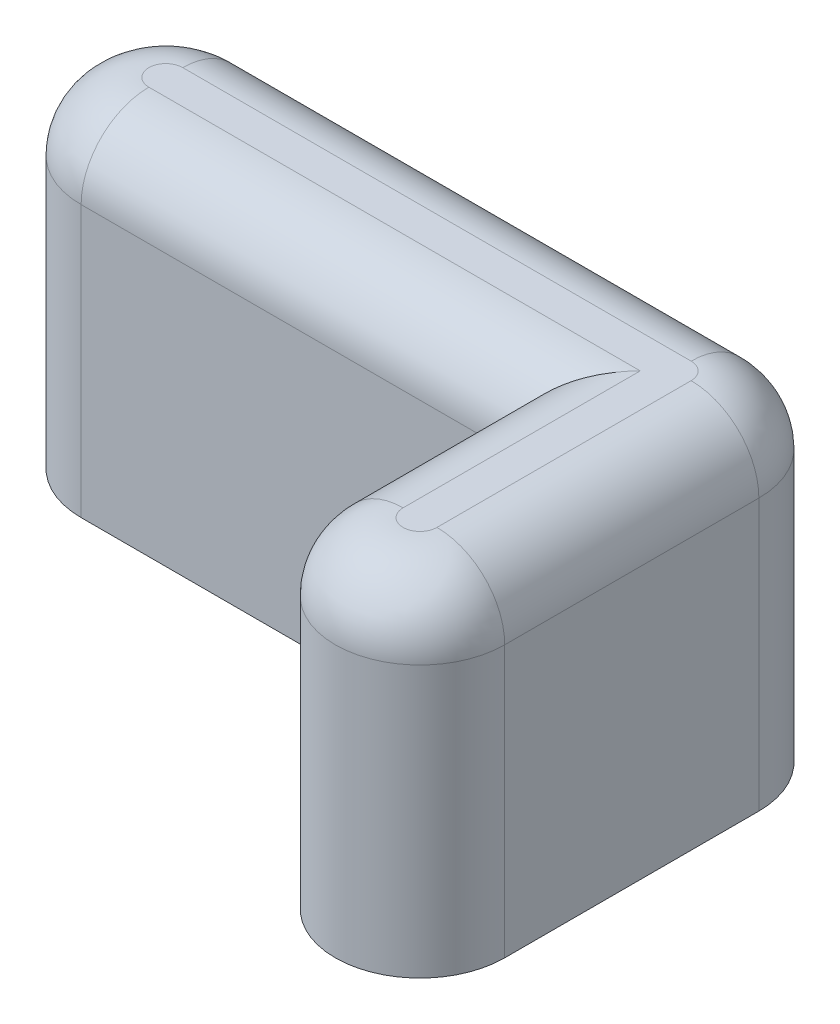
ISO-10303-21;
HEADER;
FILE_DESCRIPTION(('STEP AP214'),'2;1');
FILE_NAME('part.step','',(''),(''),'','','');
FILE_SCHEMA(('AUTOMOTIVE_DESIGN { 1 0 10303 214 1 1 1 1 }'));
ENDSEC;
DATA;
#1=APPLICATION_CONTEXT('core data for automotive mechanical design processes');
#2=APPLICATION_PROTOCOL_DEFINITION('international standard','automotive_design',2000,#1);
#3=PRODUCT_CONTEXT('',#1,'mechanical');
#4=PRODUCT('Part','Part','',(#3));
#5=PRODUCT_RELATED_PRODUCT_CATEGORY('part','',(#4));
#6=PRODUCT_DEFINITION_FORMATION('','',#4);
#7=PRODUCT_DEFINITION_CONTEXT('part definition',#1,'design');
#8=PRODUCT_DEFINITION('design','',#6,#7);
#9=PRODUCT_DEFINITION_SHAPE('','',#8);
#10=(LENGTH_UNIT() NAMED_UNIT(*) SI_UNIT(.MILLI.,.METRE.));
#11=(NAMED_UNIT(*) PLANE_ANGLE_UNIT() SI_UNIT($,.RADIAN.));
#12=(NAMED_UNIT(*) SI_UNIT($,.STERADIAN.) SOLID_ANGLE_UNIT());
#13=UNCERTAINTY_MEASURE_WITH_UNIT(LENGTH_MEASURE(1.E-05),#10,'distance_accuracy_value','');
#14=(GEOMETRIC_REPRESENTATION_CONTEXT(3) GLOBAL_UNCERTAINTY_ASSIGNED_CONTEXT((#13)) GLOBAL_UNIT_ASSIGNED_CONTEXT((#10,
#11,#12)) REPRESENTATION_CONTEXT('',''));
#15=CARTESIAN_POINT('',(0.,0.,0.));
#16=DIRECTION('',(0.,0.,1.));
#17=DIRECTION('',(1.,0.,0.));
#18=AXIS2_PLACEMENT_3D('',#15,#16,#17);
#19=CARTESIAN_POINT('',(-15.,20.,5.));
#20=DIRECTION('',(0.,0.,-1.));
#21=DIRECTION('',(-1.,0.,0.));
#22=AXIS2_PLACEMENT_3D('',#19,#20,#21);
#23=PLANE('',#22);
#24=DIRECTION('',(0.,-1.,0.));
#25=VECTOR('',#24,1.);
#26=CARTESIAN_POINT('',(10.,20.,5.));
#27=LINE('',#26,#25);
#28=CARTESIAN_POINT('',(10.,16.,5.));
#29=VERTEX_POINT('',#28);
#30=CARTESIAN_POINT('',(10.,0.,5.));
#31=VERTEX_POINT('',#30);
#32=EDGE_CURVE('E113',#29,#31,#27,.T.);
#33=ORIENTED_EDGE('',*,*,#32,.F.);
#34=DIRECTION('',(1.,0.,0.));
#35=VECTOR('',#34,1.);
#36=CARTESIAN_POINT('',(-15.,16.,5.));
#37=LINE('',#36,#35);
#38=CARTESIAN_POINT('',(-15.,16.,5.));
#39=VERTEX_POINT('',#38);
#40=EDGE_CURVE('E11',#29,#39,#37,.F.);
#41=ORIENTED_EDGE('',*,*,#40,.T.);
#42=DIRECTION('',(0.,-1.,0.));
#43=VECTOR('',#42,1.);
#44=CARTESIAN_POINT('',(-15.,20.,5.));
#45=LINE('',#44,#43);
#46=CARTESIAN_POINT('',(-15.,0.,5.));
#47=VERTEX_POINT('',#46);
#48=EDGE_CURVE('E125',#39,#47,#45,.T.);
#49=ORIENTED_EDGE('',*,*,#48,.T.);
#50=DIRECTION('',(1.,0.,0.));
#51=VECTOR('',#50,1.);
#52=CARTESIAN_POINT('',(-15.,0.,5.));
#53=LINE('',#52,#51);
#54=EDGE_CURVE('E124',#47,#31,#53,.T.);
#55=ORIENTED_EDGE('',*,*,#54,.T.);
#56=EDGE_LOOP('',(#33,#41,#49,#55));
#57=FACE_BOUND('',#56,.T.);
#58=ADVANCED_FACE('F33',(#57),#23,.F.);
#59=CARTESIAN_POINT('',(10.,20.,15.));
#60=DIRECTION('',(-1.,0.,0.));
#61=DIRECTION('',(0.,0.,1.));
#62=AXIS2_PLACEMENT_3D('',#59,#60,#61);
#63=PLANE('',#62);
#64=DIRECTION('',(0.,-1.,0.));
#65=VECTOR('',#64,1.);
#66=CARTESIAN_POINT('',(10.,20.,15.));
#67=LINE('',#66,#65);
#68=CARTESIAN_POINT('',(10.,16.,15.));
#69=VERTEX_POINT('',#68);
#70=CARTESIAN_POINT('',(10.,0.,15.));
#71=VERTEX_POINT('',#70);
#72=EDGE_CURVE('E121',#69,#71,#67,.T.);
#73=ORIENTED_EDGE('',*,*,#72,.F.);
#74=DIRECTION('',(0.,0.,-1.));
#75=VECTOR('',#74,1.);
#76=CARTESIAN_POINT('',(10.,16.,15.));
#77=LINE('',#76,#75);
#78=EDGE_CURVE('E120',#69,#29,#77,.T.);
#79=ORIENTED_EDGE('',*,*,#78,.T.);
#80=ORIENTED_EDGE('',*,*,#32,.T.);
#81=DIRECTION('',(0.,0.,-1.));
#82=VECTOR('',#81,1.);
#83=CARTESIAN_POINT('',(10.,0.,15.));
#84=LINE('',#83,#82);
#85=EDGE_CURVE('E118',#71,#31,#84,.T.);
#86=ORIENTED_EDGE('',*,*,#85,.F.);
#87=EDGE_LOOP('',(#73,#79,#80,#86));
#88=FACE_BOUND('',#87,.T.);
#89=ADVANCED_FACE('F116',(#88),#63,.T.);
#90=CARTESIAN_POINT('',(15.,20.,15.));
#91=DIRECTION('',(0.,-1.,0.));
#92=DIRECTION('',(0.,0.,-1.));
#93=AXIS2_PLACEMENT_3D('',#90,#91,#92);
#94=CYLINDRICAL_SURFACE('',#93,5.);
#95=DIRECTION('',(0.,-1.,0.));
#96=VECTOR('',#95,1.);
#97=CARTESIAN_POINT('',(20.,20.,15.));
#98=LINE('',#97,#96);
#99=CARTESIAN_POINT('',(20.,16.,15.));
#100=VERTEX_POINT('',#99);
#101=CARTESIAN_POINT('',(20.,0.,15.));
#102=VERTEX_POINT('',#101);
#103=EDGE_CURVE('E157',#100,#102,#98,.T.);
#104=ORIENTED_EDGE('',*,*,#103,.F.);
#105=CARTESIAN_POINT('',(15.,16.,15.));
#106=DIRECTION('',(0.,1.,0.));
#107=DIRECTION('',(0.,0.,1.));
#108=AXIS2_PLACEMENT_3D('',#105,#106,#107);
#109=CIRCLE('',#108,5.);
#110=EDGE_CURVE('E176',#100,#69,#109,.F.);
#111=ORIENTED_EDGE('',*,*,#110,.T.);
#112=ORIENTED_EDGE('',*,*,#72,.T.);
#113=CARTESIAN_POINT('',(15.,0.,15.));
#114=DIRECTION('',(0.,1.,0.));
#115=DIRECTION('',(0.,0.,1.));
#116=AXIS2_PLACEMENT_3D('',#113,#114,#115);
#117=CIRCLE('',#116,5.);
#118=EDGE_CURVE('E134',#71,#102,#117,.T.);
#119=ORIENTED_EDGE('',*,*,#118,.T.);
#120=EDGE_LOOP('',(#104,#111,#112,#119));
#121=FACE_BOUND('',#120,.T.);
#122=ADVANCED_FACE('F247',(#121),#94,.T.);
#123=CARTESIAN_POINT('',(20.,20.,15.));
#124=DIRECTION('',(-1.,0.,0.));
#125=DIRECTION('',(0.,0.,1.));
#126=AXIS2_PLACEMENT_3D('',#123,#124,#125);
#127=PLANE('',#126);
#128=DIRECTION('',(0.,-1.,0.));
#129=VECTOR('',#128,1.);
#130=CARTESIAN_POINT('',(20.,20.,0.));
#131=LINE('',#130,#129);
#132=CARTESIAN_POINT('',(20.,16.,0.));
#133=VERTEX_POINT('',#132);
#134=CARTESIAN_POINT('',(20.,0.,0.));
#135=VERTEX_POINT('',#134);
#136=EDGE_CURVE('E155',#133,#135,#131,.T.);
#137=ORIENTED_EDGE('',*,*,#136,.F.);
#138=DIRECTION('',(0.,0.,-1.));
#139=VECTOR('',#138,1.);
#140=CARTESIAN_POINT('',(20.,16.,15.));
#141=LINE('',#140,#139);
#142=EDGE_CURVE('E178',#133,#100,#141,.F.);
#143=ORIENTED_EDGE('',*,*,#142,.T.);
#144=ORIENTED_EDGE('',*,*,#103,.T.);
#145=DIRECTION('',(0.,0.,-1.));
#146=VECTOR('',#145,1.);
#147=CARTESIAN_POINT('',(20.,0.,15.));
#148=LINE('',#147,#146);
#149=EDGE_CURVE('E136',#102,#135,#148,.T.);
#150=ORIENTED_EDGE('',*,*,#149,.T.);
#151=EDGE_LOOP('',(#137,#143,#144,#150));
#152=FACE_BOUND('',#151,.T.);
#153=ADVANCED_FACE('F220',(#152),#127,.F.);
#154=CARTESIAN_POINT('',(15.,20.,0.));
#155=DIRECTION('',(0.,-1.,0.));
#156=DIRECTION('',(0.,0.,-1.));
#157=AXIS2_PLACEMENT_3D('',#154,#155,#156);
#158=CYLINDRICAL_SURFACE('',#157,5.);
#159=DIRECTION('',(0.,-1.,0.));
#160=VECTOR('',#159,1.);
#161=CARTESIAN_POINT('',(15.,20.,-5.));
#162=LINE('',#161,#160);
#163=CARTESIAN_POINT('',(15.,16.,-5.));
#164=VERTEX_POINT('',#163);
#165=CARTESIAN_POINT('',(15.,0.,-5.));
#166=VERTEX_POINT('',#165);
#167=EDGE_CURVE('E153',#164,#166,#162,.T.);
#168=ORIENTED_EDGE('',*,*,#167,.F.);
#169=CARTESIAN_POINT('',(15.,16.,0.));
#170=DIRECTION('',(0.,1.,0.));
#171=DIRECTION('',(0.,0.,1.));
#172=AXIS2_PLACEMENT_3D('',#169,#170,#171);
#173=CIRCLE('',#172,5.);
#174=EDGE_CURVE('E180',#164,#133,#173,.F.);
#175=ORIENTED_EDGE('',*,*,#174,.T.);
#176=ORIENTED_EDGE('',*,*,#136,.T.);
#177=CARTESIAN_POINT('',(15.,0.,0.));
#178=DIRECTION('',(0.,-1.,0.));
#179=DIRECTION('',(0.,0.,-1.));
#180=AXIS2_PLACEMENT_3D('',#177,#178,#179);
#181=CIRCLE('',#180,5.);
#182=EDGE_CURVE('E142',#166,#135,#181,.T.);
#183=ORIENTED_EDGE('',*,*,#182,.F.);
#184=EDGE_LOOP('',(#168,#175,#176,#183));
#185=FACE_BOUND('',#184,.T.);
#186=ADVANCED_FACE('F217',(#185),#158,.T.);
#187=CARTESIAN_POINT('',(15.,20.,-5.));
#188=DIRECTION('',(0.,0.,1.));
#189=DIRECTION('',(1.,0.,0.));
#190=AXIS2_PLACEMENT_3D('',#187,#188,#189);
#191=PLANE('',#190);
#192=DIRECTION('',(0.,-1.,0.));
#193=VECTOR('',#192,1.);
#194=CARTESIAN_POINT('',(-15.,20.,-5.));
#195=LINE('',#194,#193);
#196=CARTESIAN_POINT('',(-15.,16.,-5.));
#197=VERTEX_POINT('',#196);
#198=CARTESIAN_POINT('',(-15.,0.,-5.));
#199=VERTEX_POINT('',#198);
#200=EDGE_CURVE('E151',#197,#199,#195,.T.);
#201=ORIENTED_EDGE('',*,*,#200,.F.);
#202=DIRECTION('',(-1.,0.,0.));
#203=VECTOR('',#202,1.);
#204=CARTESIAN_POINT('',(15.,16.,-5.));
#205=LINE('',#204,#203);
#206=EDGE_CURVE('E182',#197,#164,#205,.F.);
#207=ORIENTED_EDGE('',*,*,#206,.T.);
#208=ORIENTED_EDGE('',*,*,#167,.T.);
#209=DIRECTION('',(-1.,0.,0.));
#210=VECTOR('',#209,1.);
#211=CARTESIAN_POINT('',(15.,0.,-5.));
#212=LINE('',#211,#210);
#213=EDGE_CURVE('E145',#166,#199,#212,.T.);
#214=ORIENTED_EDGE('',*,*,#213,.T.);
#215=EDGE_LOOP('',(#201,#207,#208,#214));
#216=FACE_BOUND('',#215,.T.);
#217=ADVANCED_FACE('F224',(#216),#191,.F.);
#218=CARTESIAN_POINT('',(-15.,20.,0.));
#219=DIRECTION('',(0.,-1.,0.));
#220=DIRECTION('',(0.,0.,-1.));
#221=AXIS2_PLACEMENT_3D('',#218,#219,#220);
#222=CYLINDRICAL_SURFACE('',#221,5.);
#223=ORIENTED_EDGE('',*,*,#48,.F.);
#224=CARTESIAN_POINT('',(-15.,16.,0.));
#225=DIRECTION('',(0.,1.,0.));
#226=DIRECTION('',(0.,0.,1.));
#227=AXIS2_PLACEMENT_3D('',#224,#225,#226);
#228=CIRCLE('',#227,5.);
#229=EDGE_CURVE('E42',#39,#197,#228,.F.);
#230=ORIENTED_EDGE('',*,*,#229,.T.);
#231=ORIENTED_EDGE('',*,*,#200,.T.);
#232=CARTESIAN_POINT('',(-15.,0.,0.));
#233=DIRECTION('',(0.,-1.,0.));
#234=DIRECTION('',(0.,0.,-1.));
#235=AXIS2_PLACEMENT_3D('',#232,#233,#234);
#236=CIRCLE('',#235,5.);
#237=EDGE_CURVE('E148',#47,#199,#236,.T.);
#238=ORIENTED_EDGE('',*,*,#237,.F.);
#239=EDGE_LOOP('',(#223,#230,#231,#238));
#240=FACE_BOUND('',#239,.T.);
#241=ADVANCED_FACE('F225',(#240),#222,.T.);
#242=CARTESIAN_POINT('',(15.,20.,15.));
#243=DIRECTION('',(0.,1.,0.));
#244=DIRECTION('',(0.,0.,1.));
#245=AXIS2_PLACEMENT_3D('',#242,#243,#244);
#246=PLANE('',#245);
#247=DIRECTION('',(1.,0.,0.));
#248=VECTOR('',#247,1.);
#249=CARTESIAN_POINT('',(10.,20.,0.999999999999998));
#250=LINE('',#249,#248);
#251=CARTESIAN_POINT('',(-15.,20.,1.));
#252=VERTEX_POINT('',#251);
#253=CARTESIAN_POINT('',(14.,20.,0.999999999999997));
#254=VERTEX_POINT('',#253);
#255=EDGE_CURVE('E161',#252,#254,#250,.T.);
#256=ORIENTED_EDGE('',*,*,#255,.T.);
#257=DIRECTION('',(0.,0.,-1.));
#258=VECTOR('',#257,1.);
#259=CARTESIAN_POINT('',(14.,20.,15.));
#260=LINE('',#259,#258);
#261=CARTESIAN_POINT('',(14.,20.,15.));
#262=VERTEX_POINT('',#261);
#263=EDGE_CURVE('E173',#254,#262,#260,.F.);
#264=ORIENTED_EDGE('',*,*,#263,.T.);
#265=CARTESIAN_POINT('',(15.,20.,15.));
#266=DIRECTION('',(0.,1.,0.));
#267=DIRECTION('',(0.,0.,1.));
#268=AXIS2_PLACEMENT_3D('',#265,#266,#267);
#269=CIRCLE('',#268,0.999999999999998);
#270=CARTESIAN_POINT('',(16.,20.,15.));
#271=VERTEX_POINT('',#270);
#272=EDGE_CURVE('E171',#262,#271,#269,.T.);
#273=ORIENTED_EDGE('',*,*,#272,.T.);
#274=DIRECTION('',(0.,0.,-1.));
#275=VECTOR('',#274,1.);
#276=CARTESIAN_POINT('',(16.,20.,0.));
#277=LINE('',#276,#275);
#278=CARTESIAN_POINT('',(16.,20.,0.));
#279=VERTEX_POINT('',#278);
#280=EDGE_CURVE('E169',#271,#279,#277,.T.);
#281=ORIENTED_EDGE('',*,*,#280,.T.);
#282=CARTESIAN_POINT('',(15.,20.,0.));
#283=DIRECTION('',(0.,1.,0.));
#284=DIRECTION('',(0.,0.,1.));
#285=AXIS2_PLACEMENT_3D('',#282,#283,#284);
#286=CIRCLE('',#285,1.);
#287=CARTESIAN_POINT('',(15.,20.,-1.));
#288=VERTEX_POINT('',#287);
#289=EDGE_CURVE('E167',#279,#288,#286,.T.);
#290=ORIENTED_EDGE('',*,*,#289,.T.);
#291=DIRECTION('',(-1.,0.,0.));
#292=VECTOR('',#291,1.);
#293=CARTESIAN_POINT('',(-15.,20.,-1.));
#294=LINE('',#293,#292);
#295=CARTESIAN_POINT('',(-15.,20.,-1.));
#296=VERTEX_POINT('',#295);
#297=EDGE_CURVE('E165',#288,#296,#294,.T.);
#298=ORIENTED_EDGE('',*,*,#297,.T.);
#299=CARTESIAN_POINT('',(-15.,20.,0.));
#300=DIRECTION('',(0.,1.,0.));
#301=DIRECTION('',(0.,0.,1.));
#302=AXIS2_PLACEMENT_3D('',#299,#300,#301);
#303=CIRCLE('',#302,1.);
#304=EDGE_CURVE('E163',#296,#252,#303,.T.);
#305=ORIENTED_EDGE('',*,*,#304,.T.);
#306=EDGE_LOOP('',(#256,#264,#273,#281,#290,#298,#305));
#307=FACE_BOUND('',#306,.T.);
#308=ADVANCED_FACE('F236',(#307),#246,.T.);
#309=CARTESIAN_POINT('',(15.,0.,15.));
#310=DIRECTION('',(0.,1.,0.));
#311=DIRECTION('',(0.,0.,1.));
#312=AXIS2_PLACEMENT_3D('',#309,#310,#311);
#313=PLANE('',#312);
#314=CARTESIAN_POINT('',(15.,0.,0.));
#315=DIRECTION('',(0.,-1.,0.));
#316=DIRECTION('',(0.,0.,-1.));
#317=AXIS2_PLACEMENT_3D('',#314,#315,#316);
#318=CIRCLE('',#317,2.75);
#319=CARTESIAN_POINT('',(15.,0.,-2.75));
#320=VERTEX_POINT('',#319);
#321=EDGE_CURVE('E397',#320,#320,#318,.T.);
#322=ORIENTED_EDGE('',*,*,#321,.F.);
#323=EDGE_LOOP('',(#322));
#324=FACE_BOUND('',#323,.T.);
#325=CARTESIAN_POINT('',(-15.,0.,0.));
#326=DIRECTION('',(0.,-1.,0.));
#327=DIRECTION('',(0.,0.,-1.));
#328=AXIS2_PLACEMENT_3D('',#325,#326,#327);
#329=CIRCLE('',#328,2.75);
#330=CARTESIAN_POINT('',(-15.,0.,-2.75));
#331=VERTEX_POINT('',#330);
#332=EDGE_CURVE('E396',#331,#331,#329,.T.);
#333=ORIENTED_EDGE('',*,*,#332,.F.);
#334=EDGE_LOOP('',(#333));
#335=FACE_BOUND('',#334,.T.);
#336=ORIENTED_EDGE('',*,*,#54,.F.);
#337=ORIENTED_EDGE('',*,*,#237,.T.);
#338=ORIENTED_EDGE('',*,*,#213,.F.);
#339=ORIENTED_EDGE('',*,*,#182,.T.);
#340=ORIENTED_EDGE('',*,*,#149,.F.);
#341=ORIENTED_EDGE('',*,*,#118,.F.);
#342=ORIENTED_EDGE('',*,*,#85,.T.);
#343=EDGE_LOOP('',(#336,#337,#338,#339,#340,#341,#342));
#344=FACE_BOUND('',#343,.T.);
#345=ADVANCED_FACE('F131',(#324,#335,#344),#313,.F.);
#346=CARTESIAN_POINT('',(15.,16.,0.));
#347=DIRECTION('',(0.,1.,0.));
#348=DIRECTION('',(0.,0.,1.));
#349=AXIS2_PLACEMENT_3D('',#346,#347,#348);
#350=DEGENERATE_TOROIDAL_SURFACE('',#349,1.,4.,.T.);
#351=CARTESIAN_POINT('',(16.,16.,0.));
#352=DIRECTION('',(0.,0.,1.));
#353=DIRECTION('',(1.,0.,0.));
#354=AXIS2_PLACEMENT_3D('',#351,#352,#353);
#355=CIRCLE('',#354,4.);
#356=EDGE_CURVE('E198',#133,#279,#355,.T.);
#357=ORIENTED_EDGE('',*,*,#356,.F.);
#358=ORIENTED_EDGE('',*,*,#174,.F.);
#359=CARTESIAN_POINT('',(15.,16.,-1.));
#360=DIRECTION('',(-1.,0.,0.));
#361=DIRECTION('',(0.,0.,1.));
#362=AXIS2_PLACEMENT_3D('',#359,#360,#361);
#363=CIRCLE('',#362,4.);
#364=EDGE_CURVE('E37',#288,#164,#363,.T.);
#365=ORIENTED_EDGE('',*,*,#364,.F.);
#366=ORIENTED_EDGE('',*,*,#289,.F.);
#367=EDGE_LOOP('',(#357,#358,#365,#366));
#368=FACE_BOUND('',#367,.T.);
#369=ADVANCED_FACE('F35',(#368),#350,.T.);
#370=CARTESIAN_POINT('',(15.,16.,-1.));
#371=DIRECTION('',(1.,0.,0.));
#372=DIRECTION('',(0.,0.,-1.));
#373=AXIS2_PLACEMENT_3D('',#370,#371,#372);
#374=CYLINDRICAL_SURFACE('',#373,4.);
#375=ORIENTED_EDGE('',*,*,#364,.T.);
#376=ORIENTED_EDGE('',*,*,#206,.F.);
#377=CARTESIAN_POINT('',(-15.,16.,-1.));
#378=DIRECTION('',(-1.,0.,0.));
#379=DIRECTION('',(0.,0.,1.));
#380=AXIS2_PLACEMENT_3D('',#377,#378,#379);
#381=CIRCLE('',#380,4.);
#382=EDGE_CURVE('E196',#296,#197,#381,.T.);
#383=ORIENTED_EDGE('',*,*,#382,.F.);
#384=ORIENTED_EDGE('',*,*,#297,.F.);
#385=EDGE_LOOP('',(#375,#376,#383,#384));
#386=FACE_BOUND('',#385,.T.);
#387=ADVANCED_FACE('F209',(#386),#374,.T.);
#388=CARTESIAN_POINT('',(16.,16.,15.));
#389=DIRECTION('',(0.,0.,1.));
#390=DIRECTION('',(1.,0.,0.));
#391=AXIS2_PLACEMENT_3D('',#388,#389,#390);
#392=CYLINDRICAL_SURFACE('',#391,4.);
#393=ORIENTED_EDGE('',*,*,#356,.T.);
#394=ORIENTED_EDGE('',*,*,#280,.F.);
#395=CARTESIAN_POINT('',(16.,16.,15.));
#396=DIRECTION('',(0.,0.,1.));
#397=DIRECTION('',(1.,0.,0.));
#398=AXIS2_PLACEMENT_3D('',#395,#396,#397);
#399=CIRCLE('',#398,4.);
#400=EDGE_CURVE('E193',#100,#271,#399,.T.);
#401=ORIENTED_EDGE('',*,*,#400,.F.);
#402=ORIENTED_EDGE('',*,*,#142,.F.);
#403=EDGE_LOOP('',(#393,#394,#401,#402));
#404=FACE_BOUND('',#403,.T.);
#405=ADVANCED_FACE('F245',(#404),#392,.T.);
#406=CARTESIAN_POINT('',(-15.,16.,0.));
#407=DIRECTION('',(0.,1.,0.));
#408=DIRECTION('',(0.,0.,1.));
#409=AXIS2_PLACEMENT_3D('',#406,#407,#408);
#410=DEGENERATE_TOROIDAL_SURFACE('',#409,1.,4.,.T.);
#411=ORIENTED_EDGE('',*,*,#382,.T.);
#412=ORIENTED_EDGE('',*,*,#229,.F.);
#413=CARTESIAN_POINT('',(-15.,16.,1.));
#414=DIRECTION('',(1.,0.,0.));
#415=DIRECTION('',(0.,0.,-1.));
#416=AXIS2_PLACEMENT_3D('',#413,#414,#415);
#417=CIRCLE('',#416,4.);
#418=EDGE_CURVE('E190',#252,#39,#417,.T.);
#419=ORIENTED_EDGE('',*,*,#418,.F.);
#420=ORIENTED_EDGE('',*,*,#304,.F.);
#421=EDGE_LOOP('',(#411,#412,#419,#420));
#422=FACE_BOUND('',#421,.T.);
#423=ADVANCED_FACE('F228',(#422),#410,.T.);
#424=CARTESIAN_POINT('',(15.,16.,15.));
#425=DIRECTION('',(0.,1.,0.));
#426=DIRECTION('',(0.,0.,1.));
#427=AXIS2_PLACEMENT_3D('',#424,#425,#426);
#428=DEGENERATE_TOROIDAL_SURFACE('',#427,0.999999999999998,4.,.T.);
#429=ORIENTED_EDGE('',*,*,#400,.T.);
#430=ORIENTED_EDGE('',*,*,#272,.F.);
#431=CARTESIAN_POINT('',(14.,16.,15.));
#432=DIRECTION('',(0.,0.,-1.));
#433=DIRECTION('',(-1.,0.,0.));
#434=AXIS2_PLACEMENT_3D('',#431,#432,#433);
#435=CIRCLE('',#434,4.);
#436=EDGE_CURVE('E187',#69,#262,#435,.T.);
#437=ORIENTED_EDGE('',*,*,#436,.F.);
#438=ORIENTED_EDGE('',*,*,#110,.F.);
#439=EDGE_LOOP('',(#429,#430,#437,#438));
#440=FACE_BOUND('',#439,.T.);
#441=ADVANCED_FACE('F243',(#440),#428,.T.);
#442=CARTESIAN_POINT('',(15.,16.,0.999999999999997));
#443=DIRECTION('',(-1.,0.,0.));
#444=DIRECTION('',(0.,0.,1.));
#445=AXIS2_PLACEMENT_3D('',#442,#443,#444);
#446=CYLINDRICAL_SURFACE('',#445,4.);
#447=ORIENTED_EDGE('',*,*,#418,.T.);
#448=ORIENTED_EDGE('',*,*,#40,.F.);
#449=CARTESIAN_POINT('',(14.,16.,0.999999999999997));
#450=DIRECTION('',(-0.707106781186547,0.,-0.707106781186547));
#451=DIRECTION('',(0.707106781186547,0.,-0.707106781186547));
#452=AXIS2_PLACEMENT_3D('',#449,#450,#451);
#453=ELLIPSE('',#452,5.65685424949238,4.);
#454=EDGE_CURVE('E185',#254,#29,#453,.F.);
#455=ORIENTED_EDGE('',*,*,#454,.F.);
#456=ORIENTED_EDGE('',*,*,#255,.F.);
#457=EDGE_LOOP('',(#447,#448,#455,#456));
#458=FACE_BOUND('',#457,.T.);
#459=ADVANCED_FACE('F232',(#458),#446,.T.);
#460=CARTESIAN_POINT('',(14.,16.,15.));
#461=DIRECTION('',(0.,0.,-1.));
#462=DIRECTION('',(-1.,0.,0.));
#463=AXIS2_PLACEMENT_3D('',#460,#461,#462);
#464=CYLINDRICAL_SURFACE('',#463,4.);
#465=ORIENTED_EDGE('',*,*,#436,.T.);
#466=ORIENTED_EDGE('',*,*,#263,.F.);
#467=ORIENTED_EDGE('',*,*,#454,.T.);
#468=ORIENTED_EDGE('',*,*,#78,.F.);
#469=EDGE_LOOP('',(#465,#466,#467,#468));
#470=FACE_BOUND('',#469,.T.);
#471=ADVANCED_FACE('F238',(#470),#464,.T.);
#472=CARTESIAN_POINT('',(-15.,1.5,0.));
#473=DIRECTION('',(0.,-1.,0.));
#474=DIRECTION('',(0.,0.,-1.));
#475=AXIS2_PLACEMENT_3D('',#472,#473,#474);
#476=CYLINDRICAL_SURFACE('',#475,2.75);
#477=CARTESIAN_POINT('',(-15.,1.5,0.));
#478=DIRECTION('',(0.,-1.,0.));
#479=DIRECTION('',(0.,0.,-1.));
#480=AXIS2_PLACEMENT_3D('',#477,#478,#479);
#481=CIRCLE('',#480,2.75);
#482=CARTESIAN_POINT('',(-15.,1.5,-2.75));
#483=VERTEX_POINT('',#482);
#484=EDGE_CURVE('E188',#483,#483,#481,.T.);
#485=ORIENTED_EDGE('',*,*,#484,.F.);
#486=EDGE_LOOP('',(#485));
#487=FACE_BOUND('',#486,.T.);
#488=ORIENTED_EDGE('',*,*,#332,.T.);
#489=EDGE_LOOP('',(#488));
#490=FACE_BOUND('',#489,.T.);
#491=ADVANCED_FACE('F263',(#487,#490),#476,.F.);
#492=CARTESIAN_POINT('',(-15.,1.5,0.));
#493=DIRECTION('',(0.,-1.,0.));
#494=DIRECTION('',(0.,0.,-1.));
#495=AXIS2_PLACEMENT_3D('',#492,#493,#494);
#496=PLANE('',#495);
#497=ORIENTED_EDGE('',*,*,#484,.T.);
#498=EDGE_LOOP('',(#497));
#499=FACE_BOUND('',#498,.T.);
#500=ADVANCED_FACE('F357',(#499),#496,.T.);
#501=CARTESIAN_POINT('',(15.,1.5,0.));
#502=DIRECTION('',(0.,-1.,0.));
#503=DIRECTION('',(0.,0.,-1.));
#504=AXIS2_PLACEMENT_3D('',#501,#502,#503);
#505=CYLINDRICAL_SURFACE('',#504,2.75);
#506=CARTESIAN_POINT('',(15.,1.5,0.));
#507=DIRECTION('',(0.,-1.,0.));
#508=DIRECTION('',(0.,0.,-1.));
#509=AXIS2_PLACEMENT_3D('',#506,#507,#508);
#510=CIRCLE('',#509,2.75);
#511=CARTESIAN_POINT('',(15.,1.5,-2.75));
#512=VERTEX_POINT('',#511);
#513=EDGE_CURVE('E395',#512,#512,#510,.T.);
#514=ORIENTED_EDGE('',*,*,#513,.F.);
#515=EDGE_LOOP('',(#514));
#516=FACE_BOUND('',#515,.T.);
#517=ORIENTED_EDGE('',*,*,#321,.T.);
#518=EDGE_LOOP('',(#517));
#519=FACE_BOUND('',#518,.T.);
#520=ADVANCED_FACE('F365',(#516,#519),#505,.F.);
#521=CARTESIAN_POINT('',(15.,1.5,0.));
#522=DIRECTION('',(0.,-1.,0.));
#523=DIRECTION('',(0.,0.,-1.));
#524=AXIS2_PLACEMENT_3D('',#521,#522,#523);
#525=PLANE('',#524);
#526=ORIENTED_EDGE('',*,*,#513,.T.);
#527=EDGE_LOOP('',(#526));
#528=FACE_BOUND('',#527,.T.);
#529=ADVANCED_FACE('F379',(#528),#525,.T.);
#530=CLOSED_SHELL('',(#58,#89,#122,#153,#186,#217,#241,#308,#345,#369,#387,#405,#423,#441,#459,
#471,#491,#500,#520,#529));
#531=MANIFOLD_SOLID_BREP('B2',#530);
#532=ADVANCED_BREP_SHAPE_REPRESENTATION('',(#18,#531),#14);
#533=SHAPE_DEFINITION_REPRESENTATION(#9,#532);
ENDSEC;
END-ISO-10303-21;
